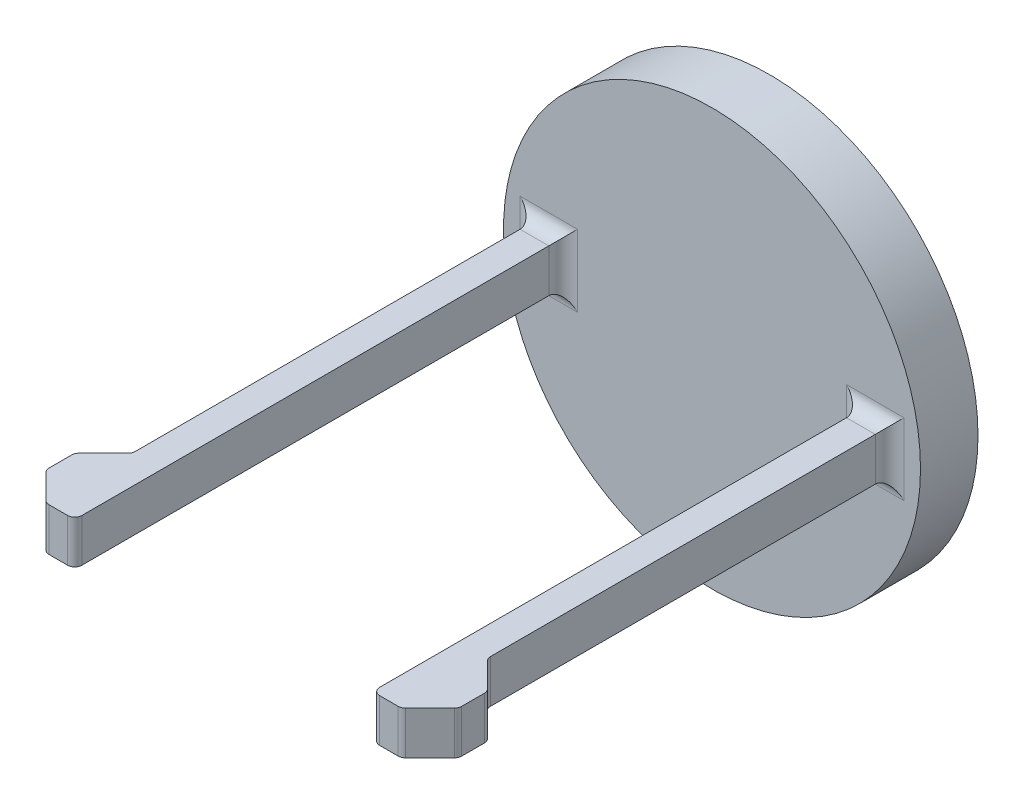
ISO-10303-21;
HEADER;
FILE_DESCRIPTION(('STEP AP214'),'2;1');
FILE_NAME('part.step','',(''),(''),'','','');
FILE_SCHEMA(('AUTOMOTIVE_DESIGN { 1 0 10303 214 1 1 1 1 }'));
ENDSEC;
DATA;
#1=APPLICATION_CONTEXT('core data for automotive mechanical design processes');
#2=APPLICATION_PROTOCOL_DEFINITION('international standard','automotive_design',2000,#1);
#3=PRODUCT_CONTEXT('',#1,'mechanical');
#4=PRODUCT('Part','Part','',(#3));
#5=PRODUCT_RELATED_PRODUCT_CATEGORY('part','',(#4));
#6=PRODUCT_DEFINITION_FORMATION('','',#4);
#7=PRODUCT_DEFINITION_CONTEXT('part definition',#1,'design');
#8=PRODUCT_DEFINITION('design','',#6,#7);
#9=PRODUCT_DEFINITION_SHAPE('','',#8);
#10=(LENGTH_UNIT() NAMED_UNIT(*) SI_UNIT(.MILLI.,.METRE.));
#11=(NAMED_UNIT(*) PLANE_ANGLE_UNIT() SI_UNIT($,.RADIAN.));
#12=(NAMED_UNIT(*) SI_UNIT($,.STERADIAN.) SOLID_ANGLE_UNIT());
#13=UNCERTAINTY_MEASURE_WITH_UNIT(LENGTH_MEASURE(1.E-05),#10,'distance_accuracy_value','');
#14=(GEOMETRIC_REPRESENTATION_CONTEXT(3) GLOBAL_UNCERTAINTY_ASSIGNED_CONTEXT((#13)) GLOBAL_UNIT_ASSIGNED_CONTEXT((#10,
#11,#12)) REPRESENTATION_CONTEXT('',''));
#15=CARTESIAN_POINT('',(0.,0.,0.));
#16=DIRECTION('',(0.,0.,1.));
#17=DIRECTION('',(1.,0.,0.));
#18=AXIS2_PLACEMENT_3D('',#15,#16,#17);
#19=CARTESIAN_POINT('',(12.3535100827569,1.5,37.9738477170273));
#20=DIRECTION('',(0.,-1.,0.));
#21=DIRECTION('',(0.,0.,-1.));
#22=AXIS2_PLACEMENT_3D('',#19,#20,#21);
#23=PLANE('',#22);
#24=DIRECTION('',(0.,0.,-1.));
#25=VECTOR('',#24,1.);
#26=CARTESIAN_POINT('',(10.3535100827569,1.5,37.9738477170273));
#27=LINE('',#26,#25);
#28=CARTESIAN_POINT('',(10.3535100827569,1.5,37.4738477170273));
#29=VERTEX_POINT('',#28);
#30=CARTESIAN_POINT('',(10.3535100827569,1.5,5.));
#31=VERTEX_POINT('',#30);
#32=EDGE_CURVE('E408',#29,#31,#27,.T.);
#33=ORIENTED_EDGE('',*,*,#32,.F.);
#34=CARTESIAN_POINT('',(10.8535100827569,1.5,37.4738477170273));
#35=DIRECTION('',(0.,-1.,0.));
#36=DIRECTION('',(0.,0.,-1.));
#37=AXIS2_PLACEMENT_3D('',#34,#35,#36);
#38=CIRCLE('',#37,0.5);
#39=CARTESIAN_POINT('',(10.8535100827569,1.5,37.9738477170273));
#40=VERTEX_POINT('',#39);
#41=EDGE_CURVE('E379',#29,#40,#38,.F.);
#42=ORIENTED_EDGE('',*,*,#41,.T.);
#43=DIRECTION('',(-1.,0.,0.));
#44=VECTOR('',#43,1.);
#45=CARTESIAN_POINT('',(12.3535100827569,1.5,37.9738477170273));
#46=LINE('',#45,#44);
#47=CARTESIAN_POINT('',(12.1464033015703,1.5,37.9738477170273));
#48=VERTEX_POINT('',#47);
#49=EDGE_CURVE('E456',#48,#40,#46,.T.);
#50=ORIENTED_EDGE('',*,*,#49,.F.);
#51=CARTESIAN_POINT('',(12.1464033015703,1.5,37.4738477170273));
#52=DIRECTION('',(0.,-1.,0.));
#53=DIRECTION('',(0.,0.,-1.));
#54=AXIS2_PLACEMENT_3D('',#51,#52,#53);
#55=CIRCLE('',#54,0.5);
#56=CARTESIAN_POINT('',(12.4999566921636,1.5,37.8274011076206));
#57=VERTEX_POINT('',#56);
#58=EDGE_CURVE('E377',#48,#57,#55,.F.);
#59=ORIENTED_EDGE('',*,*,#58,.T.);
#60=DIRECTION('',(-0.707106781186552,0.,0.707106781186543));
#61=VECTOR('',#60,1.);
#62=CARTESIAN_POINT('',(12.3535100827569,1.5,37.9738477170273));
#63=LINE('',#62,#61);
#64=CARTESIAN_POINT('',(14.2070634733501,1.5,36.1202943264341));
#65=VERTEX_POINT('',#64);
#66=EDGE_CURVE('E307',#65,#57,#63,.T.);
#67=ORIENTED_EDGE('',*,*,#66,.F.);
#68=CARTESIAN_POINT('',(13.8535100827569,1.5,35.7667409358408));
#69=DIRECTION('',(0.,-1.,0.));
#70=DIRECTION('',(0.,0.,-1.));
#71=AXIS2_PLACEMENT_3D('',#68,#69,#70);
#72=CIRCLE('',#71,0.5);
#73=CARTESIAN_POINT('',(14.3535100827569,1.5,35.7667409358408));
#74=VERTEX_POINT('',#73);
#75=EDGE_CURVE('E376',#65,#74,#72,.F.);
#76=ORIENTED_EDGE('',*,*,#75,.T.);
#77=DIRECTION('',(0.,0.,1.));
#78=VECTOR('',#77,1.);
#79=CARTESIAN_POINT('',(14.3535100827569,1.5,37.9738477170273));
#80=LINE('',#79,#78);
#81=CARTESIAN_POINT('',(14.3535100827569,1.5,34.1809544982138));
#82=VERTEX_POINT('',#81);
#83=EDGE_CURVE('E430',#82,#74,#80,.T.);
#84=ORIENTED_EDGE('',*,*,#83,.F.);
#85=CARTESIAN_POINT('',(13.8535100827569,1.5,34.1809544982138));
#86=DIRECTION('',(0.,-1.,0.));
#87=DIRECTION('',(0.,0.,-1.));
#88=AXIS2_PLACEMENT_3D('',#85,#86,#87);
#89=CIRCLE('',#88,0.5);
#90=CARTESIAN_POINT('',(14.2070634733501,1.5,33.8274011076206));
#91=VERTEX_POINT('',#90);
#92=EDGE_CURVE('E53',#82,#91,#89,.F.);
#93=ORIENTED_EDGE('',*,*,#92,.T.);
#94=DIRECTION('',(0.707106781186551,0.,0.707106781186544));
#95=VECTOR('',#94,1.);
#96=CARTESIAN_POINT('',(12.3535100827569,1.5,31.9738477170273));
#97=LINE('',#96,#95);
#98=CARTESIAN_POINT('',(12.4999566921636,1.5,32.120294326434));
#99=VERTEX_POINT('',#98);
#100=EDGE_CURVE('E404',#99,#91,#97,.T.);
#101=ORIENTED_EDGE('',*,*,#100,.F.);
#102=CARTESIAN_POINT('',(12.8535100827569,1.5,31.7667409358408));
#103=DIRECTION('',(0.,-1.,0.));
#104=DIRECTION('',(0.,0.,-1.));
#105=AXIS2_PLACEMENT_3D('',#102,#103,#104);
#106=CIRCLE('',#105,0.5);
#107=CARTESIAN_POINT('',(12.3535100827569,1.5,31.7667409358408));
#108=VERTEX_POINT('',#107);
#109=EDGE_CURVE('E50',#99,#108,#106,.T.);
#110=ORIENTED_EDGE('',*,*,#109,.T.);
#111=DIRECTION('',(0.,0.,-1.));
#112=VECTOR('',#111,1.);
#113=CARTESIAN_POINT('',(12.3535100827569,1.5,37.9738477170273));
#114=LINE('',#113,#112);
#115=CARTESIAN_POINT('',(12.3535100827569,1.5,5.));
#116=VERTEX_POINT('',#115);
#117=EDGE_CURVE('E401',#108,#116,#114,.T.);
#118=ORIENTED_EDGE('',*,*,#117,.T.);
#119=DIRECTION('',(-1.,0.,0.));
#120=VECTOR('',#119,1.);
#121=CARTESIAN_POINT('',(12.3535100827569,1.5,5.));
#122=LINE('',#121,#120);
#123=EDGE_CURVE('E247',#116,#31,#122,.T.);
#124=ORIENTED_EDGE('',*,*,#123,.T.);
#125=EDGE_LOOP('',(#33,#42,#50,#59,#67,#76,#84,#93,#101,#110,#118,#124));
#126=FACE_BOUND('',#125,.T.);
#127=ADVANCED_FACE('F39',(#126),#23,.F.);
#128=CARTESIAN_POINT('',(12.3535100827569,-1.5,37.9738477170273));
#129=DIRECTION('',(0.,1.,0.));
#130=DIRECTION('',(0.,0.,1.));
#131=AXIS2_PLACEMENT_3D('',#128,#129,#130);
#132=PLANE('',#131);
#133=DIRECTION('',(1.,0.,0.));
#134=VECTOR('',#133,1.);
#135=CARTESIAN_POINT('',(12.3535100827569,-1.5,37.9738477170273));
#136=LINE('',#135,#134);
#137=CARTESIAN_POINT('',(10.8535100827569,-1.5,37.9738477170273));
#138=VERTEX_POINT('',#137);
#139=CARTESIAN_POINT('',(12.1464033015703,-1.5,37.9738477170273));
#140=VERTEX_POINT('',#139);
#141=EDGE_CURVE('E468',#138,#140,#136,.T.);
#142=ORIENTED_EDGE('',*,*,#141,.F.);
#143=CARTESIAN_POINT('',(10.8535100827569,-1.5,37.4738477170273));
#144=DIRECTION('',(0.,1.,0.));
#145=DIRECTION('',(0.,0.,1.));
#146=AXIS2_PLACEMENT_3D('',#143,#144,#145);
#147=CIRCLE('',#146,0.5);
#148=CARTESIAN_POINT('',(10.3535100827569,-1.5,37.4738477170273));
#149=VERTEX_POINT('',#148);
#150=EDGE_CURVE('E371',#138,#149,#147,.F.);
#151=ORIENTED_EDGE('',*,*,#150,.T.);
#152=DIRECTION('',(0.,0.,-1.));
#153=VECTOR('',#152,1.);
#154=CARTESIAN_POINT('',(10.3535100827569,-1.5,37.9738477170273));
#155=LINE('',#154,#153);
#156=CARTESIAN_POINT('',(10.3535100827569,-1.5,5.));
#157=VERTEX_POINT('',#156);
#158=EDGE_CURVE('E470',#149,#157,#155,.T.);
#159=ORIENTED_EDGE('',*,*,#158,.T.);
#160=DIRECTION('',(1.,0.,0.));
#161=VECTOR('',#160,1.);
#162=CARTESIAN_POINT('',(12.3535100827569,-1.5,5.));
#163=LINE('',#162,#161);
#164=CARTESIAN_POINT('',(12.3535100827569,-1.5,5.));
#165=VERTEX_POINT('',#164);
#166=EDGE_CURVE('E292',#157,#165,#163,.T.);
#167=ORIENTED_EDGE('',*,*,#166,.T.);
#168=DIRECTION('',(0.,0.,-1.));
#169=VECTOR('',#168,1.);
#170=CARTESIAN_POINT('',(12.3535100827569,-1.5,37.9738477170273));
#171=LINE('',#170,#169);
#172=CARTESIAN_POINT('',(12.3535100827569,-1.5,31.7667409358408));
#173=VERTEX_POINT('',#172);
#174=EDGE_CURVE('E419',#173,#165,#171,.T.);
#175=ORIENTED_EDGE('',*,*,#174,.F.);
#176=CARTESIAN_POINT('',(12.8535100827569,-1.5,31.7667409358408));
#177=DIRECTION('',(0.,1.,0.));
#178=DIRECTION('',(0.,0.,1.));
#179=AXIS2_PLACEMENT_3D('',#176,#177,#178);
#180=CIRCLE('',#179,0.5);
#181=CARTESIAN_POINT('',(12.4999566921636,-1.5,32.120294326434));
#182=VERTEX_POINT('',#181);
#183=EDGE_CURVE('E11',#173,#182,#180,.T.);
#184=ORIENTED_EDGE('',*,*,#183,.T.);
#185=DIRECTION('',(-0.707106781186551,0.,-0.707106781186544));
#186=VECTOR('',#185,1.);
#187=CARTESIAN_POINT('',(12.3535100827569,-1.5,31.9738477170273));
#188=LINE('',#187,#186);
#189=CARTESIAN_POINT('',(14.2070634733501,-1.5,33.8274011076206));
#190=VERTEX_POINT('',#189);
#191=EDGE_CURVE('E418',#190,#182,#188,.T.);
#192=ORIENTED_EDGE('',*,*,#191,.F.);
#193=CARTESIAN_POINT('',(13.8535100827569,-1.5,34.1809544982138));
#194=DIRECTION('',(0.,1.,0.));
#195=DIRECTION('',(0.,0.,1.));
#196=AXIS2_PLACEMENT_3D('',#193,#194,#195);
#197=CIRCLE('',#196,0.5);
#198=CARTESIAN_POINT('',(14.3535100827569,-1.5,34.1809544982138));
#199=VERTEX_POINT('',#198);
#200=EDGE_CURVE('E362',#190,#199,#197,.F.);
#201=ORIENTED_EDGE('',*,*,#200,.T.);
#202=DIRECTION('',(0.,0.,-1.));
#203=VECTOR('',#202,1.);
#204=CARTESIAN_POINT('',(14.3535100827569,-1.5,37.9738477170273));
#205=LINE('',#204,#203);
#206=CARTESIAN_POINT('',(14.3535100827569,-1.5,35.7667409358408));
#207=VERTEX_POINT('',#206);
#208=EDGE_CURVE('E425',#207,#199,#205,.T.);
#209=ORIENTED_EDGE('',*,*,#208,.F.);
#210=CARTESIAN_POINT('',(13.8535100827569,-1.5,35.7667409358408));
#211=DIRECTION('',(0.,1.,0.));
#212=DIRECTION('',(0.,0.,1.));
#213=AXIS2_PLACEMENT_3D('',#210,#211,#212);
#214=CIRCLE('',#213,0.5);
#215=CARTESIAN_POINT('',(14.2070634733501,-1.5,36.1202943264341));
#216=VERTEX_POINT('',#215);
#217=EDGE_CURVE('E370',#207,#216,#214,.F.);
#218=ORIENTED_EDGE('',*,*,#217,.T.);
#219=DIRECTION('',(0.707106781186552,0.,-0.707106781186543));
#220=VECTOR('',#219,1.);
#221=CARTESIAN_POINT('',(12.3535100827569,-1.5,37.9738477170273));
#222=LINE('',#221,#220);
#223=CARTESIAN_POINT('',(12.4999566921636,-1.5,37.8274011076206));
#224=VERTEX_POINT('',#223);
#225=EDGE_CURVE('E429',#224,#216,#222,.T.);
#226=ORIENTED_EDGE('',*,*,#225,.F.);
#227=CARTESIAN_POINT('',(12.1464033015703,-1.5,37.4738477170273));
#228=DIRECTION('',(0.,1.,0.));
#229=DIRECTION('',(0.,0.,1.));
#230=AXIS2_PLACEMENT_3D('',#227,#228,#229);
#231=CIRCLE('',#230,0.5);
#232=EDGE_CURVE('E367',#224,#140,#231,.F.);
#233=ORIENTED_EDGE('',*,*,#232,.T.);
#234=EDGE_LOOP('',(#142,#151,#159,#167,#175,#184,#192,#201,#209,#218,#226,#233));
#235=FACE_BOUND('',#234,.T.);
#236=ADVANCED_FACE('F417',(#235),#132,.F.);
#237=CARTESIAN_POINT('',(0.,0.,37.9738477170273));
#238=DIRECTION('',(0.,0.,-1.));
#239=DIRECTION('',(-1.,0.,0.));
#240=AXIS2_PLACEMENT_3D('',#237,#238,#239);
#241=PLANE('',#240);
#242=ORIENTED_EDGE('',*,*,#49,.T.);
#243=DIRECTION('',(0.,-1.,0.));
#244=VECTOR('',#243,1.);
#245=CARTESIAN_POINT('',(10.8535100827569,0.,37.9738477170273));
#246=LINE('',#245,#244);
#247=EDGE_CURVE('E365',#40,#138,#246,.T.);
#248=ORIENTED_EDGE('',*,*,#247,.T.);
#249=ORIENTED_EDGE('',*,*,#141,.T.);
#250=DIRECTION('',(0.,-1.,0.));
#251=VECTOR('',#250,1.);
#252=CARTESIAN_POINT('',(12.1464033015703,0.,37.9738477170273));
#253=LINE('',#252,#251);
#254=EDGE_CURVE('E359',#140,#48,#253,.F.);
#255=ORIENTED_EDGE('',*,*,#254,.T.);
#256=EDGE_LOOP('',(#242,#248,#249,#255));
#257=FACE_BOUND('',#256,.T.);
#258=ADVANCED_FACE('F480',(#257),#241,.F.);
#259=CARTESIAN_POINT('',(14.3535100827569,0.,0.));
#260=DIRECTION('',(1.,0.,0.));
#261=DIRECTION('',(0.,0.,-1.));
#262=AXIS2_PLACEMENT_3D('',#259,#260,#261);
#263=PLANE('',#262);
#264=ORIENTED_EDGE('',*,*,#83,.T.);
#265=DIRECTION('',(0.,-1.,0.));
#266=VECTOR('',#265,1.);
#267=CARTESIAN_POINT('',(14.3535100827569,-1.5,35.7667409358408));
#268=LINE('',#267,#266);
#269=EDGE_CURVE('E386',#74,#207,#268,.T.);
#270=ORIENTED_EDGE('',*,*,#269,.T.);
#271=ORIENTED_EDGE('',*,*,#208,.T.);
#272=DIRECTION('',(0.,-1.,0.));
#273=VECTOR('',#272,1.);
#274=CARTESIAN_POINT('',(14.3535100827569,1.5,34.1809544982138));
#275=LINE('',#274,#273);
#276=EDGE_CURVE('E390',#199,#82,#275,.F.);
#277=ORIENTED_EDGE('',*,*,#276,.T.);
#278=EDGE_LOOP('',(#264,#270,#271,#277));
#279=FACE_BOUND('',#278,.T.);
#280=ADVANCED_FACE('F536',(#279),#263,.T.);
#281=CARTESIAN_POINT('',(12.3535100827569,1.5,37.9738477170273));
#282=DIRECTION('',(-1.,0.,0.));
#283=DIRECTION('',(0.,0.,1.));
#284=AXIS2_PLACEMENT_3D('',#281,#282,#283);
#285=PLANE('',#284);
#286=ORIENTED_EDGE('',*,*,#117,.F.);
#287=DIRECTION('',(0.,1.,0.));
#288=VECTOR('',#287,1.);
#289=CARTESIAN_POINT('',(12.3535100827569,-1.5,31.7667409358408));
#290=LINE('',#289,#288);
#291=EDGE_CURVE('E400',#108,#173,#290,.F.);
#292=ORIENTED_EDGE('',*,*,#291,.T.);
#293=ORIENTED_EDGE('',*,*,#174,.T.);
#294=DIRECTION('',(0.,1.,0.));
#295=VECTOR('',#294,1.);
#296=CARTESIAN_POINT('',(12.3535100827569,1.5,5.));
#297=LINE('',#296,#295);
#298=EDGE_CURVE('E250',#165,#116,#297,.T.);
#299=ORIENTED_EDGE('',*,*,#298,.T.);
#300=EDGE_LOOP('',(#286,#292,#293,#299));
#301=FACE_BOUND('',#300,.T.);
#302=ADVANCED_FACE('F407',(#301),#285,.F.);
#303=CARTESIAN_POINT('',(-12.3535100827569,1.5,37.9738477170273));
#304=DIRECTION('',(0.,-1.,0.));
#305=DIRECTION('',(0.,0.,-1.));
#306=AXIS2_PLACEMENT_3D('',#303,#304,#305);
#307=PLANE('',#306);
#308=DIRECTION('',(0.707106781186551,0.,-0.707106781186544));
#309=VECTOR('',#308,1.);
#310=CARTESIAN_POINT('',(-12.3535100827569,1.5,31.9738477170273));
#311=LINE('',#310,#309);
#312=CARTESIAN_POINT('',(-14.2070634733501,1.5,33.8274011076206));
#313=VERTEX_POINT('',#312);
#314=CARTESIAN_POINT('',(-12.4999566921636,1.5,32.120294326434));
#315=VERTEX_POINT('',#314);
#316=EDGE_CURVE('E445',#313,#315,#311,.T.);
#317=ORIENTED_EDGE('',*,*,#316,.F.);
#318=CARTESIAN_POINT('',(-13.8535100827569,1.5,34.1809544982138));
#319=DIRECTION('',(0.,-1.,0.));
#320=DIRECTION('',(0.,0.,-1.));
#321=AXIS2_PLACEMENT_3D('',#318,#319,#320);
#322=CIRCLE('',#321,0.5);
#323=CARTESIAN_POINT('',(-14.3535100827569,1.5,34.1809544982138));
#324=VERTEX_POINT('',#323);
#325=EDGE_CURVE('E343',#313,#324,#322,.F.);
#326=ORIENTED_EDGE('',*,*,#325,.T.);
#327=DIRECTION('',(0.,0.,-1.));
#328=VECTOR('',#327,1.);
#329=CARTESIAN_POINT('',(-14.3535100827569,1.5,37.9738477170273));
#330=LINE('',#329,#328);
#331=CARTESIAN_POINT('',(-14.3535100827569,1.5,35.7667409358408));
#332=VERTEX_POINT('',#331);
#333=EDGE_CURVE('E447',#332,#324,#330,.T.);
#334=ORIENTED_EDGE('',*,*,#333,.F.);
#335=CARTESIAN_POINT('',(-13.8535100827569,1.5,35.7667409358408));
#336=DIRECTION('',(0.,-1.,0.));
#337=DIRECTION('',(0.,0.,-1.));
#338=AXIS2_PLACEMENT_3D('',#335,#336,#337);
#339=CIRCLE('',#338,0.5);
#340=CARTESIAN_POINT('',(-14.2070634733501,1.5,36.120294326434));
#341=VERTEX_POINT('',#340);
#342=EDGE_CURVE('E344',#332,#341,#339,.F.);
#343=ORIENTED_EDGE('',*,*,#342,.T.);
#344=DIRECTION('',(-0.707106781186551,0.,-0.707106781186544));
#345=VECTOR('',#344,1.);
#346=CARTESIAN_POINT('',(-12.3535100827569,1.5,37.9738477170273));
#347=LINE('',#346,#345);
#348=CARTESIAN_POINT('',(-12.4999566921636,1.5,37.8274011076206));
#349=VERTEX_POINT('',#348);
#350=EDGE_CURVE('E442',#349,#341,#347,.T.);
#351=ORIENTED_EDGE('',*,*,#350,.F.);
#352=CARTESIAN_POINT('',(-12.1464033015703,1.5,37.4738477170273));
#353=DIRECTION('',(0.,-1.,0.));
#354=DIRECTION('',(0.,0.,-1.));
#355=AXIS2_PLACEMENT_3D('',#352,#353,#354);
#356=CIRCLE('',#355,0.5);
#357=CARTESIAN_POINT('',(-12.1464033015703,1.5,37.9738477170273));
#358=VERTEX_POINT('',#357);
#359=EDGE_CURVE('E342',#349,#358,#356,.F.);
#360=ORIENTED_EDGE('',*,*,#359,.T.);
#361=DIRECTION('',(-1.,0.,0.));
#362=VECTOR('',#361,1.);
#363=CARTESIAN_POINT('',(-12.3535100827569,1.5,37.9738477170273));
#364=LINE('',#363,#362);
#365=CARTESIAN_POINT('',(-10.8535100827569,1.5,37.9738477170273));
#366=VERTEX_POINT('',#365);
#367=EDGE_CURVE('E453',#366,#358,#364,.T.);
#368=ORIENTED_EDGE('',*,*,#367,.F.);
#369=CARTESIAN_POINT('',(-10.8535100827569,1.5,37.4738477170273));
#370=DIRECTION('',(0.,-1.,0.));
#371=DIRECTION('',(0.,0.,-1.));
#372=AXIS2_PLACEMENT_3D('',#369,#370,#371);
#373=CIRCLE('',#372,0.5);
#374=CARTESIAN_POINT('',(-10.3535100827569,1.5,37.4738477170273));
#375=VERTEX_POINT('',#374);
#376=EDGE_CURVE('E339',#366,#375,#373,.F.);
#377=ORIENTED_EDGE('',*,*,#376,.T.);
#378=DIRECTION('',(0.,0.,-1.));
#379=VECTOR('',#378,1.);
#380=CARTESIAN_POINT('',(-10.3535100827569,1.5,37.9738477170273));
#381=LINE('',#380,#379);
#382=CARTESIAN_POINT('',(-10.3535100827569,1.5,5.));
#383=VERTEX_POINT('',#382);
#384=EDGE_CURVE('E463',#375,#383,#381,.T.);
#385=ORIENTED_EDGE('',*,*,#384,.T.);
#386=DIRECTION('',(-1.,0.,0.));
#387=VECTOR('',#386,1.);
#388=CARTESIAN_POINT('',(-12.3535100827569,1.5,5.));
#389=LINE('',#388,#387);
#390=CARTESIAN_POINT('',(-12.3535100827569,1.5,5.));
#391=VERTEX_POINT('',#390);
#392=EDGE_CURVE('E289',#383,#391,#389,.T.);
#393=ORIENTED_EDGE('',*,*,#392,.T.);
#394=DIRECTION('',(0.,0.,-1.));
#395=VECTOR('',#394,1.);
#396=CARTESIAN_POINT('',(-12.3535100827569,1.5,37.9738477170273));
#397=LINE('',#396,#395);
#398=CARTESIAN_POINT('',(-12.3535100827569,1.5,31.7667409358408));
#399=VERTEX_POINT('',#398);
#400=EDGE_CURVE('E236',#399,#391,#397,.T.);
#401=ORIENTED_EDGE('',*,*,#400,.F.);
#402=CARTESIAN_POINT('',(-12.8535100827569,1.5,31.7667409358408));
#403=DIRECTION('',(0.,-1.,0.));
#404=DIRECTION('',(0.,0.,-1.));
#405=AXIS2_PLACEMENT_3D('',#402,#403,#404);
#406=CIRCLE('',#405,0.5);
#407=EDGE_CURVE('E399',#399,#315,#406,.T.);
#408=ORIENTED_EDGE('',*,*,#407,.T.);
#409=EDGE_LOOP('',(#317,#326,#334,#343,#351,#360,#368,#377,#385,#393,#401,#408));
#410=FACE_BOUND('',#409,.T.);
#411=ADVANCED_FACE('F547',(#410),#307,.F.);
#412=CARTESIAN_POINT('',(-12.3535100827569,-1.5,37.9738477170273));
#413=DIRECTION('',(0.,1.,0.));
#414=DIRECTION('',(0.,0.,1.));
#415=AXIS2_PLACEMENT_3D('',#412,#413,#414);
#416=PLANE('',#415);
#417=DIRECTION('',(0.,0.,1.));
#418=VECTOR('',#417,1.);
#419=CARTESIAN_POINT('',(-14.3535100827569,-1.5,37.9738477170273));
#420=LINE('',#419,#418);
#421=CARTESIAN_POINT('',(-14.3535100827569,-1.5,34.1809544982138));
#422=VERTEX_POINT('',#421);
#423=CARTESIAN_POINT('',(-14.3535100827569,-1.5,35.7667409358408));
#424=VERTEX_POINT('',#423);
#425=EDGE_CURVE('E412',#422,#424,#420,.T.);
#426=ORIENTED_EDGE('',*,*,#425,.F.);
#427=CARTESIAN_POINT('',(-13.8535100827569,-1.5,34.1809544982138));
#428=DIRECTION('',(0.,1.,0.));
#429=DIRECTION('',(0.,0.,1.));
#430=AXIS2_PLACEMENT_3D('',#427,#428,#429);
#431=CIRCLE('',#430,0.5);
#432=CARTESIAN_POINT('',(-14.2070634733501,-1.5,33.8274011076206));
#433=VERTEX_POINT('',#432);
#434=EDGE_CURVE('E340',#422,#433,#431,.F.);
#435=ORIENTED_EDGE('',*,*,#434,.T.);
#436=DIRECTION('',(-0.707106781186551,0.,0.707106781186544));
#437=VECTOR('',#436,1.);
#438=CARTESIAN_POINT('',(-12.3535100827569,-1.5,31.9738477170273));
#439=LINE('',#438,#437);
#440=CARTESIAN_POINT('',(-12.4999566921636,-1.5,32.120294326434));
#441=VERTEX_POINT('',#440);
#442=EDGE_CURVE('E437',#441,#433,#439,.T.);
#443=ORIENTED_EDGE('',*,*,#442,.F.);
#444=CARTESIAN_POINT('',(-12.8535100827569,-1.5,31.7667409358408));
#445=DIRECTION('',(0.,1.,0.));
#446=DIRECTION('',(0.,0.,1.));
#447=AXIS2_PLACEMENT_3D('',#444,#445,#446);
#448=CIRCLE('',#447,0.5);
#449=CARTESIAN_POINT('',(-12.3535100827569,-1.5,31.7667409358408));
#450=VERTEX_POINT('',#449);
#451=EDGE_CURVE('E231',#441,#450,#448,.T.);
#452=ORIENTED_EDGE('',*,*,#451,.T.);
#453=DIRECTION('',(0.,0.,-1.));
#454=VECTOR('',#453,1.);
#455=CARTESIAN_POINT('',(-12.3535100827569,-1.5,37.9738477170273));
#456=LINE('',#455,#454);
#457=CARTESIAN_POINT('',(-12.3535100827569,-1.5,5.));
#458=VERTEX_POINT('',#457);
#459=EDGE_CURVE('E224',#450,#458,#456,.T.);
#460=ORIENTED_EDGE('',*,*,#459,.T.);
#461=DIRECTION('',(1.,0.,0.));
#462=VECTOR('',#461,1.);
#463=CARTESIAN_POINT('',(-12.3535100827569,-1.5,5.));
#464=LINE('',#463,#462);
#465=CARTESIAN_POINT('',(-10.3535100827569,-1.5,5.));
#466=VERTEX_POINT('',#465);
#467=EDGE_CURVE('E233',#458,#466,#464,.T.);
#468=ORIENTED_EDGE('',*,*,#467,.T.);
#469=DIRECTION('',(0.,0.,-1.));
#470=VECTOR('',#469,1.);
#471=CARTESIAN_POINT('',(-10.3535100827569,-1.5,37.9738477170273));
#472=LINE('',#471,#470);
#473=CARTESIAN_POINT('',(-10.3535100827569,-1.5,37.4738477170273));
#474=VERTEX_POINT('',#473);
#475=EDGE_CURVE('E240',#474,#466,#472,.T.);
#476=ORIENTED_EDGE('',*,*,#475,.F.);
#477=CARTESIAN_POINT('',(-10.8535100827569,-1.5,37.4738477170273));
#478=DIRECTION('',(0.,1.,0.));
#479=DIRECTION('',(0.,0.,1.));
#480=AXIS2_PLACEMENT_3D('',#477,#478,#479);
#481=CIRCLE('',#480,0.5);
#482=CARTESIAN_POINT('',(-10.8535100827569,-1.5,37.9738477170273));
#483=VERTEX_POINT('',#482);
#484=EDGE_CURVE('E331',#474,#483,#481,.F.);
#485=ORIENTED_EDGE('',*,*,#484,.T.);
#486=DIRECTION('',(1.,0.,0.));
#487=VECTOR('',#486,1.);
#488=CARTESIAN_POINT('',(-12.3535100827569,-1.5,37.9738477170273));
#489=LINE('',#488,#487);
#490=CARTESIAN_POINT('',(-12.1464033015703,-1.5,37.9738477170273));
#491=VERTEX_POINT('',#490);
#492=EDGE_CURVE('E459',#491,#483,#489,.T.);
#493=ORIENTED_EDGE('',*,*,#492,.F.);
#494=CARTESIAN_POINT('',(-12.1464033015703,-1.5,37.4738477170273));
#495=DIRECTION('',(0.,1.,0.));
#496=DIRECTION('',(0.,0.,1.));
#497=AXIS2_PLACEMENT_3D('',#494,#495,#496);
#498=CIRCLE('',#497,0.5);
#499=CARTESIAN_POINT('',(-12.4999566921636,-1.5,37.8274011076206));
#500=VERTEX_POINT('',#499);
#501=EDGE_CURVE('E332',#491,#500,#498,.F.);
#502=ORIENTED_EDGE('',*,*,#501,.T.);
#503=DIRECTION('',(0.707106781186551,0.,0.707106781186544));
#504=VECTOR('',#503,1.);
#505=CARTESIAN_POINT('',(-12.3535100827569,-1.5,37.9738477170273));
#506=LINE('',#505,#504);
#507=CARTESIAN_POINT('',(-14.2070634733501,-1.5,36.120294326434));
#508=VERTEX_POINT('',#507);
#509=EDGE_CURVE('E438',#508,#500,#506,.T.);
#510=ORIENTED_EDGE('',*,*,#509,.F.);
#511=CARTESIAN_POINT('',(-13.8535100827569,-1.5,35.7667409358408));
#512=DIRECTION('',(0.,1.,0.));
#513=DIRECTION('',(0.,0.,1.));
#514=AXIS2_PLACEMENT_3D('',#511,#512,#513);
#515=CIRCLE('',#514,0.5);
#516=EDGE_CURVE('E334',#508,#424,#515,.F.);
#517=ORIENTED_EDGE('',*,*,#516,.T.);
#518=EDGE_LOOP('',(#426,#435,#443,#452,#460,#468,#476,#485,#493,#502,#510,#517));
#519=FACE_BOUND('',#518,.T.);
#520=ADVANCED_FACE('F226',(#519),#416,.F.);
#521=CARTESIAN_POINT('',(0.,0.,37.9738477170273));
#522=DIRECTION('',(0.,0.,1.));
#523=DIRECTION('',(1.,0.,0.));
#524=AXIS2_PLACEMENT_3D('',#521,#522,#523);
#525=PLANE('',#524);
#526=ORIENTED_EDGE('',*,*,#367,.T.);
#527=DIRECTION('',(0.,-1.,0.));
#528=VECTOR('',#527,1.);
#529=CARTESIAN_POINT('',(-12.1464033015703,-1.5,37.9738477170273));
#530=LINE('',#529,#528);
#531=EDGE_CURVE('E354',#358,#491,#530,.T.);
#532=ORIENTED_EDGE('',*,*,#531,.T.);
#533=ORIENTED_EDGE('',*,*,#492,.T.);
#534=DIRECTION('',(0.,1.,0.));
#535=VECTOR('',#534,1.);
#536=CARTESIAN_POINT('',(-10.8535100827569,1.5,37.9738477170273));
#537=LINE('',#536,#535);
#538=EDGE_CURVE('E355',#483,#366,#537,.T.);
#539=ORIENTED_EDGE('',*,*,#538,.T.);
#540=EDGE_LOOP('',(#526,#532,#533,#539));
#541=FACE_BOUND('',#540,.T.);
#542=ADVANCED_FACE('F562',(#541),#525,.T.);
#543=CARTESIAN_POINT('',(-14.3535100827569,0.,0.));
#544=DIRECTION('',(-1.,0.,0.));
#545=DIRECTION('',(0.,0.,1.));
#546=AXIS2_PLACEMENT_3D('',#543,#544,#545);
#547=PLANE('',#546);
#548=ORIENTED_EDGE('',*,*,#333,.T.);
#549=DIRECTION('',(0.,-1.,0.));
#550=VECTOR('',#549,1.);
#551=CARTESIAN_POINT('',(-14.3535100827569,-1.5,34.1809544982138));
#552=LINE('',#551,#550);
#553=EDGE_CURVE('E329',#324,#422,#552,.T.);
#554=ORIENTED_EDGE('',*,*,#553,.T.);
#555=ORIENTED_EDGE('',*,*,#425,.T.);
#556=DIRECTION('',(0.,-1.,0.));
#557=VECTOR('',#556,1.);
#558=CARTESIAN_POINT('',(-14.3535100827569,1.5,35.7667409358408));
#559=LINE('',#558,#557);
#560=EDGE_CURVE('E327',#424,#332,#559,.F.);
#561=ORIENTED_EDGE('',*,*,#560,.T.);
#562=EDGE_LOOP('',(#548,#554,#555,#561));
#563=FACE_BOUND('',#562,.T.);
#564=ADVANCED_FACE('F561',(#563),#547,.T.);
#565=CARTESIAN_POINT('',(-12.3535100827569,1.5,37.9738477170273));
#566=DIRECTION('',(1.,0.,0.));
#567=DIRECTION('',(0.,0.,-1.));
#568=AXIS2_PLACEMENT_3D('',#565,#566,#567);
#569=PLANE('',#568);
#570=ORIENTED_EDGE('',*,*,#459,.F.);
#571=DIRECTION('',(0.,-1.,0.));
#572=VECTOR('',#571,1.);
#573=CARTESIAN_POINT('',(-12.3535100827569,1.5,31.7667409358408));
#574=LINE('',#573,#572);
#575=EDGE_CURVE('E321',#450,#399,#574,.F.);
#576=ORIENTED_EDGE('',*,*,#575,.T.);
#577=ORIENTED_EDGE('',*,*,#400,.T.);
#578=DIRECTION('',(0.,-1.,0.));
#579=VECTOR('',#578,1.);
#580=CARTESIAN_POINT('',(-12.3535100827569,1.5,5.));
#581=LINE('',#580,#579);
#582=EDGE_CURVE('E239',#391,#458,#581,.T.);
#583=ORIENTED_EDGE('',*,*,#582,.T.);
#584=EDGE_LOOP('',(#570,#576,#577,#583));
#585=FACE_BOUND('',#584,.T.);
#586=ADVANCED_FACE('F245',(#585),#569,.F.);
#587=CARTESIAN_POINT('',(0.,0.,4.));
#588=DIRECTION('',(0.,0.,-1.));
#589=DIRECTION('',(-1.,0.,0.));
#590=AXIS2_PLACEMENT_3D('',#587,#588,#589);
#591=CYLINDRICAL_SURFACE('',#590,14.5);
#592=CARTESIAN_POINT('',(0.,0.,4.));
#593=DIRECTION('',(0.,0.,1.));
#594=DIRECTION('',(1.,0.,0.));
#595=AXIS2_PLACEMENT_3D('',#592,#593,#594);
#596=CIRCLE('',#595,14.5);
#597=CARTESIAN_POINT('',(14.5,0.,4.));
#598=VERTEX_POINT('',#597);
#599=EDGE_CURVE('E263',#598,#598,#596,.T.);
#600=ORIENTED_EDGE('',*,*,#599,.F.);
#601=EDGE_LOOP('',(#600));
#602=FACE_BOUND('',#601,.T.);
#603=CARTESIAN_POINT('',(0.,0.,0.));
#604=DIRECTION('',(0.,0.,1.));
#605=DIRECTION('',(1.,0.,0.));
#606=AXIS2_PLACEMENT_3D('',#603,#604,#605);
#607=CIRCLE('',#606,14.5);
#608=CARTESIAN_POINT('',(14.5,0.,0.));
#609=VERTEX_POINT('',#608);
#610=EDGE_CURVE('E269',#609,#609,#607,.T.);
#611=ORIENTED_EDGE('',*,*,#610,.T.);
#612=EDGE_LOOP('',(#611));
#613=FACE_BOUND('',#612,.T.);
#614=ADVANCED_FACE('F509',(#602,#613),#591,.T.);
#615=CARTESIAN_POINT('',(0.,0.,4.));
#616=DIRECTION('',(0.,0.,1.));
#617=DIRECTION('',(1.,0.,0.));
#618=AXIS2_PLACEMENT_3D('',#615,#616,#617);
#619=PLANE('',#618);
#620=DIRECTION('',(0.,1.,0.));
#621=VECTOR('',#620,1.);
#622=CARTESIAN_POINT('',(-9.35351008275688,0.,4.));
#623=LINE('',#622,#621);
#624=CARTESIAN_POINT('',(-9.35351008275688,2.5,4.));
#625=VERTEX_POINT('',#624);
#626=CARTESIAN_POINT('',(-9.35351008275688,-2.5,4.));
#627=VERTEX_POINT('',#626);
#628=EDGE_CURVE('E284',#625,#627,#623,.F.);
#629=ORIENTED_EDGE('',*,*,#628,.T.);
#630=DIRECTION('',(1.,0.,0.));
#631=VECTOR('',#630,1.);
#632=CARTESIAN_POINT('',(0.,-2.5,4.));
#633=LINE('',#632,#631);
#634=CARTESIAN_POINT('',(-13.3535100827569,-2.5,4.));
#635=VERTEX_POINT('',#634);
#636=EDGE_CURVE('E283',#627,#635,#633,.F.);
#637=ORIENTED_EDGE('',*,*,#636,.T.);
#638=DIRECTION('',(0.,-1.,0.));
#639=VECTOR('',#638,1.);
#640=CARTESIAN_POINT('',(-13.3535100827569,0.,4.));
#641=LINE('',#640,#639);
#642=CARTESIAN_POINT('',(-13.3535100827569,2.5,4.));
#643=VERTEX_POINT('',#642);
#644=EDGE_CURVE('E254',#635,#643,#641,.F.);
#645=ORIENTED_EDGE('',*,*,#644,.T.);
#646=DIRECTION('',(-1.,0.,0.));
#647=VECTOR('',#646,1.);
#648=CARTESIAN_POINT('',(0.,2.5,4.));
#649=LINE('',#648,#647);
#650=EDGE_CURVE('E282',#643,#625,#649,.F.);
#651=ORIENTED_EDGE('',*,*,#650,.T.);
#652=EDGE_LOOP('',(#629,#637,#645,#651));
#653=FACE_BOUND('',#652,.T.);
#654=DIRECTION('',(0.,1.,0.));
#655=VECTOR('',#654,1.);
#656=CARTESIAN_POINT('',(13.3535100827569,0.,4.));
#657=LINE('',#656,#655);
#658=CARTESIAN_POINT('',(13.3535100827569,2.5,4.));
#659=VERTEX_POINT('',#658);
#660=CARTESIAN_POINT('',(13.3535100827569,-2.5,4.));
#661=VERTEX_POINT('',#660);
#662=EDGE_CURVE('E261',#659,#661,#657,.F.);
#663=ORIENTED_EDGE('',*,*,#662,.T.);
#664=DIRECTION('',(1.,0.,0.));
#665=VECTOR('',#664,1.);
#666=CARTESIAN_POINT('',(0.,-2.5,4.));
#667=LINE('',#666,#665);
#668=CARTESIAN_POINT('',(9.35351008275688,-2.5,4.));
#669=VERTEX_POINT('',#668);
#670=EDGE_CURVE('E280',#661,#669,#667,.F.);
#671=ORIENTED_EDGE('',*,*,#670,.T.);
#672=DIRECTION('',(0.,-1.,0.));
#673=VECTOR('',#672,1.);
#674=CARTESIAN_POINT('',(9.35351008275688,0.,4.));
#675=LINE('',#674,#673);
#676=CARTESIAN_POINT('',(9.35351008275688,2.5,4.));
#677=VERTEX_POINT('',#676);
#678=EDGE_CURVE('E273',#669,#677,#675,.F.);
#679=ORIENTED_EDGE('',*,*,#678,.T.);
#680=DIRECTION('',(-1.,0.,0.));
#681=VECTOR('',#680,1.);
#682=CARTESIAN_POINT('',(0.,2.5,4.));
#683=LINE('',#682,#681);
#684=EDGE_CURVE('E270',#677,#659,#683,.F.);
#685=ORIENTED_EDGE('',*,*,#684,.T.);
#686=EDGE_LOOP('',(#663,#671,#679,#685));
#687=FACE_BOUND('',#686,.T.);
#688=ORIENTED_EDGE('',*,*,#599,.T.);
#689=EDGE_LOOP('',(#688));
#690=FACE_BOUND('',#689,.T.);
#691=ADVANCED_FACE('F506',(#653,#687,#690),#619,.T.);
#692=CARTESIAN_POINT('',(0.,0.,0.));
#693=DIRECTION('',(0.,0.,1.));
#694=DIRECTION('',(1.,0.,0.));
#695=AXIS2_PLACEMENT_3D('',#692,#693,#694);
#696=PLANE('',#695);
#697=ORIENTED_EDGE('',*,*,#610,.F.);
#698=EDGE_LOOP('',(#697));
#699=FACE_BOUND('',#698,.T.);
#700=ADVANCED_FACE('F508',(#699),#696,.F.);
#701=CARTESIAN_POINT('',(10.3535100827569,1.5,37.9738477170273));
#702=DIRECTION('',(1.,0.,0.));
#703=DIRECTION('',(0.,0.,-1.));
#704=AXIS2_PLACEMENT_3D('',#701,#702,#703);
#705=PLANE('',#704);
#706=ORIENTED_EDGE('',*,*,#158,.F.);
#707=DIRECTION('',(0.,-1.,0.));
#708=VECTOR('',#707,1.);
#709=CARTESIAN_POINT('',(10.3535100827569,1.5,37.4738477170273));
#710=LINE('',#709,#708);
#711=EDGE_CURVE('E373',#149,#29,#710,.F.);
#712=ORIENTED_EDGE('',*,*,#711,.T.);
#713=ORIENTED_EDGE('',*,*,#32,.T.);
#714=DIRECTION('',(0.,-1.,0.));
#715=VECTOR('',#714,1.);
#716=CARTESIAN_POINT('',(10.3535100827569,1.5,5.));
#717=LINE('',#716,#715);
#718=EDGE_CURVE('E294',#31,#157,#717,.T.);
#719=ORIENTED_EDGE('',*,*,#718,.T.);
#720=EDGE_LOOP('',(#706,#712,#713,#719));
#721=FACE_BOUND('',#720,.T.);
#722=ADVANCED_FACE('F488',(#721),#705,.F.);
#723=CARTESIAN_POINT('',(-10.3535100827569,1.5,37.9738477170273));
#724=DIRECTION('',(-1.,0.,0.));
#725=DIRECTION('',(0.,0.,1.));
#726=AXIS2_PLACEMENT_3D('',#723,#724,#725);
#727=PLANE('',#726);
#728=ORIENTED_EDGE('',*,*,#384,.F.);
#729=DIRECTION('',(0.,1.,0.));
#730=VECTOR('',#729,1.);
#731=CARTESIAN_POINT('',(-10.3535100827569,-1.5,37.4738477170273));
#732=LINE('',#731,#730);
#733=EDGE_CURVE('E356',#375,#474,#732,.F.);
#734=ORIENTED_EDGE('',*,*,#733,.T.);
#735=ORIENTED_EDGE('',*,*,#475,.T.);
#736=DIRECTION('',(0.,1.,0.));
#737=VECTOR('',#736,1.);
#738=CARTESIAN_POINT('',(-10.3535100827569,1.5,5.));
#739=LINE('',#738,#737);
#740=EDGE_CURVE('E290',#466,#383,#739,.T.);
#741=ORIENTED_EDGE('',*,*,#740,.T.);
#742=EDGE_LOOP('',(#728,#734,#735,#741));
#743=FACE_BOUND('',#742,.T.);
#744=ADVANCED_FACE('F526',(#743),#727,.F.);
#745=CARTESIAN_POINT('',(-12.3535100827569,14.501,37.9738477170273));
#746=DIRECTION('',(0.707106781186544,0.,-0.707106781186551));
#747=DIRECTION('',(-0.707106781186551,0.,-0.707106781186544));
#748=AXIS2_PLACEMENT_3D('',#745,#746,#747);
#749=PLANE('',#748);
#750=ORIENTED_EDGE('',*,*,#350,.T.);
#751=DIRECTION('',(0.,-1.,0.));
#752=VECTOR('',#751,1.);
#753=CARTESIAN_POINT('',(-14.2070634733501,-1.5,36.120294326434));
#754=LINE('',#753,#752);
#755=EDGE_CURVE('E346',#341,#508,#754,.T.);
#756=ORIENTED_EDGE('',*,*,#755,.T.);
#757=ORIENTED_EDGE('',*,*,#509,.T.);
#758=DIRECTION('',(0.,-1.,0.));
#759=VECTOR('',#758,1.);
#760=CARTESIAN_POINT('',(-12.4999566921636,1.5,37.8274011076206));
#761=LINE('',#760,#759);
#762=EDGE_CURVE('E350',#500,#349,#761,.F.);
#763=ORIENTED_EDGE('',*,*,#762,.T.);
#764=EDGE_LOOP('',(#750,#756,#757,#763));
#765=FACE_BOUND('',#764,.T.);
#766=ADVANCED_FACE('F558',(#765),#749,.F.);
#767=CARTESIAN_POINT('',(-12.3535100827569,14.501,31.9738477170273));
#768=DIRECTION('',(0.707106781186544,0.,0.707106781186551));
#769=DIRECTION('',(0.707106781186551,0.,-0.707106781186544));
#770=AXIS2_PLACEMENT_3D('',#767,#768,#769);
#771=PLANE('',#770);
#772=ORIENTED_EDGE('',*,*,#316,.T.);
#773=DIRECTION('',(0.,-1.,0.));
#774=VECTOR('',#773,1.);
#775=CARTESIAN_POINT('',(-12.4999566921636,-1.5,32.120294326434));
#776=LINE('',#775,#774);
#777=EDGE_CURVE('E322',#315,#441,#776,.T.);
#778=ORIENTED_EDGE('',*,*,#777,.T.);
#779=ORIENTED_EDGE('',*,*,#442,.T.);
#780=DIRECTION('',(0.,-1.,0.));
#781=VECTOR('',#780,1.);
#782=CARTESIAN_POINT('',(-14.2070634733501,1.5,33.8274011076206));
#783=LINE('',#782,#781);
#784=EDGE_CURVE('E305',#433,#313,#783,.F.);
#785=ORIENTED_EDGE('',*,*,#784,.T.);
#786=EDGE_LOOP('',(#772,#778,#779,#785));
#787=FACE_BOUND('',#786,.T.);
#788=ADVANCED_FACE('F551',(#787),#771,.F.);
#789=CARTESIAN_POINT('',(12.3535100827569,14.501,37.9738477170273));
#790=DIRECTION('',(-0.707106781186543,0.,-0.707106781186552));
#791=DIRECTION('',(-0.707106781186552,0.,0.707106781186543));
#792=AXIS2_PLACEMENT_3D('',#789,#790,#791);
#793=PLANE('',#792);
#794=ORIENTED_EDGE('',*,*,#66,.T.);
#795=DIRECTION('',(0.,-1.,0.));
#796=VECTOR('',#795,1.);
#797=CARTESIAN_POINT('',(12.4999566921636,14.501,37.8274011076206));
#798=LINE('',#797,#796);
#799=EDGE_CURVE('E381',#57,#224,#798,.T.);
#800=ORIENTED_EDGE('',*,*,#799,.T.);
#801=ORIENTED_EDGE('',*,*,#225,.T.);
#802=DIRECTION('',(0.,-1.,0.));
#803=VECTOR('',#802,1.);
#804=CARTESIAN_POINT('',(14.2070634733501,1.5,36.1202943264341));
#805=LINE('',#804,#803);
#806=EDGE_CURVE('E385',#216,#65,#805,.F.);
#807=ORIENTED_EDGE('',*,*,#806,.T.);
#808=EDGE_LOOP('',(#794,#800,#801,#807));
#809=FACE_BOUND('',#808,.T.);
#810=ADVANCED_FACE('F553',(#809),#793,.F.);
#811=CARTESIAN_POINT('',(12.3535100827569,14.501,31.9738477170273));
#812=DIRECTION('',(-0.707106781186544,0.,0.707106781186551));
#813=DIRECTION('',(0.707106781186551,0.,0.707106781186544));
#814=AXIS2_PLACEMENT_3D('',#811,#812,#813);
#815=PLANE('',#814);
#816=ORIENTED_EDGE('',*,*,#100,.T.);
#817=DIRECTION('',(0.,-1.,0.));
#818=VECTOR('',#817,1.);
#819=CARTESIAN_POINT('',(14.2070634733501,-1.5,33.8274011076206));
#820=LINE('',#819,#818);
#821=EDGE_CURVE('E391',#91,#190,#820,.T.);
#822=ORIENTED_EDGE('',*,*,#821,.T.);
#823=ORIENTED_EDGE('',*,*,#191,.T.);
#824=DIRECTION('',(0.,1.,0.));
#825=VECTOR('',#824,1.);
#826=CARTESIAN_POINT('',(12.4999566921636,1.5,32.120294326434));
#827=LINE('',#826,#825);
#828=EDGE_CURVE('E395',#182,#99,#827,.T.);
#829=ORIENTED_EDGE('',*,*,#828,.T.);
#830=EDGE_LOOP('',(#816,#822,#823,#829));
#831=FACE_BOUND('',#830,.T.);
#832=ADVANCED_FACE('F422',(#831),#815,.F.);
#833=CARTESIAN_POINT('',(-12.3535100827569,2.5,5.));
#834=DIRECTION('',(-1.,0.,0.));
#835=DIRECTION('',(0.,0.,1.));
#836=AXIS2_PLACEMENT_3D('',#833,#834,#835);
#837=CYLINDRICAL_SURFACE('',#836,1.);
#838=CARTESIAN_POINT('',(-9.35351008275688,2.5,5.));
#839=DIRECTION('',(-0.707106781186547,0.707106781186547,0.));
#840=DIRECTION('',(-0.707106781186547,-0.707106781186547,0.));
#841=AXIS2_PLACEMENT_3D('',#838,#839,#840);
#842=ELLIPSE('',#841,1.41421356237309,1.);
#843=EDGE_CURVE('E260',#625,#383,#842,.T.);
#844=ORIENTED_EDGE('',*,*,#843,.F.);
#845=ORIENTED_EDGE('',*,*,#650,.F.);
#846=CARTESIAN_POINT('',(-13.3535100827569,2.5,5.));
#847=DIRECTION('',(-0.707106781186547,-0.707106781186547,0.));
#848=DIRECTION('',(0.707106781186547,-0.707106781186547,0.));
#849=AXIS2_PLACEMENT_3D('',#846,#847,#848);
#850=ELLIPSE('',#849,1.41421356237309,1.);
#851=EDGE_CURVE('E310',#391,#643,#850,.F.);
#852=ORIENTED_EDGE('',*,*,#851,.F.);
#853=ORIENTED_EDGE('',*,*,#392,.F.);
#854=EDGE_LOOP('',(#844,#845,#852,#853));
#855=FACE_BOUND('',#854,.T.);
#856=ADVANCED_FACE('F614',(#855),#837,.F.);
#857=CARTESIAN_POINT('',(-13.3535100827569,1.5,5.));
#858=DIRECTION('',(0.,-1.,0.));
#859=DIRECTION('',(0.,0.,-1.));
#860=AXIS2_PLACEMENT_3D('',#857,#858,#859);
#861=CYLINDRICAL_SURFACE('',#860,1.);
#862=ORIENTED_EDGE('',*,*,#851,.T.);
#863=ORIENTED_EDGE('',*,*,#644,.F.);
#864=CARTESIAN_POINT('',(-13.3535100827569,-2.5,5.));
#865=DIRECTION('',(0.707106781186547,-0.707106781186547,0.));
#866=DIRECTION('',(-0.707106781186547,-0.707106781186547,0.));
#867=AXIS2_PLACEMENT_3D('',#864,#865,#866);
#868=ELLIPSE('',#867,1.41421356237309,1.);
#869=EDGE_CURVE('E252',#458,#635,#868,.F.);
#870=ORIENTED_EDGE('',*,*,#869,.F.);
#871=ORIENTED_EDGE('',*,*,#582,.F.);
#872=EDGE_LOOP('',(#862,#863,#870,#871));
#873=FACE_BOUND('',#872,.T.);
#874=ADVANCED_FACE('F255',(#873),#861,.F.);
#875=CARTESIAN_POINT('',(-9.35351008275688,1.5,5.));
#876=DIRECTION('',(0.,1.,0.));
#877=DIRECTION('',(0.,0.,1.));
#878=AXIS2_PLACEMENT_3D('',#875,#876,#877);
#879=CYLINDRICAL_SURFACE('',#878,1.);
#880=ORIENTED_EDGE('',*,*,#843,.T.);
#881=ORIENTED_EDGE('',*,*,#740,.F.);
#882=CARTESIAN_POINT('',(-9.35351008275688,-2.5,5.));
#883=DIRECTION('',(0.707106781186547,0.707106781186547,0.));
#884=DIRECTION('',(-0.707106781186547,0.707106781186547,0.));
#885=AXIS2_PLACEMENT_3D('',#882,#883,#884);
#886=ELLIPSE('',#885,1.41421356237309,1.);
#887=EDGE_CURVE('E259',#627,#466,#886,.T.);
#888=ORIENTED_EDGE('',*,*,#887,.F.);
#889=ORIENTED_EDGE('',*,*,#628,.F.);
#890=EDGE_LOOP('',(#880,#881,#888,#889));
#891=FACE_BOUND('',#890,.T.);
#892=ADVANCED_FACE('F616',(#891),#879,.F.);
#893=CARTESIAN_POINT('',(-12.3535100827569,-2.5,5.));
#894=DIRECTION('',(1.,0.,0.));
#895=DIRECTION('',(0.,0.,-1.));
#896=AXIS2_PLACEMENT_3D('',#893,#894,#895);
#897=CYLINDRICAL_SURFACE('',#896,1.);
#898=ORIENTED_EDGE('',*,*,#869,.T.);
#899=ORIENTED_EDGE('',*,*,#636,.F.);
#900=ORIENTED_EDGE('',*,*,#887,.T.);
#901=ORIENTED_EDGE('',*,*,#467,.F.);
#902=EDGE_LOOP('',(#898,#899,#900,#901));
#903=FACE_BOUND('',#902,.T.);
#904=ADVANCED_FACE('F262',(#903),#897,.F.);
#905=CARTESIAN_POINT('',(12.3535100827569,2.5,5.));
#906=DIRECTION('',(-1.,0.,0.));
#907=DIRECTION('',(0.,0.,1.));
#908=AXIS2_PLACEMENT_3D('',#905,#906,#907);
#909=CYLINDRICAL_SURFACE('',#908,1.);
#910=CARTESIAN_POINT('',(13.3535100827569,2.5,5.));
#911=DIRECTION('',(-0.707106781186547,0.707106781186547,0.));
#912=DIRECTION('',(0.707106781186547,0.707106781186547,0.));
#913=AXIS2_PLACEMENT_3D('',#910,#911,#912);
#914=ELLIPSE('',#913,1.41421356237309,1.);
#915=EDGE_CURVE('E314',#659,#116,#914,.T.);
#916=ORIENTED_EDGE('',*,*,#915,.F.);
#917=ORIENTED_EDGE('',*,*,#684,.F.);
#918=CARTESIAN_POINT('',(9.35351008275688,2.5,5.));
#919=DIRECTION('',(-0.707106781186547,-0.707106781186547,0.));
#920=DIRECTION('',(-0.707106781186547,0.707106781186547,0.));
#921=AXIS2_PLACEMENT_3D('',#918,#919,#920);
#922=ELLIPSE('',#921,1.41421356237309,1.);
#923=EDGE_CURVE('E303',#31,#677,#922,.F.);
#924=ORIENTED_EDGE('',*,*,#923,.F.);
#925=ORIENTED_EDGE('',*,*,#123,.F.);
#926=EDGE_LOOP('',(#916,#917,#924,#925));
#927=FACE_BOUND('',#926,.T.);
#928=ADVANCED_FACE('F503',(#927),#909,.F.);
#929=CARTESIAN_POINT('',(9.35351008275688,1.5,5.));
#930=DIRECTION('',(0.,-1.,0.));
#931=DIRECTION('',(0.,0.,-1.));
#932=AXIS2_PLACEMENT_3D('',#929,#930,#931);
#933=CYLINDRICAL_SURFACE('',#932,1.);
#934=ORIENTED_EDGE('',*,*,#923,.T.);
#935=ORIENTED_EDGE('',*,*,#678,.F.);
#936=CARTESIAN_POINT('',(9.35351008275688,-2.5,5.));
#937=DIRECTION('',(0.707106781186547,-0.707106781186547,0.));
#938=DIRECTION('',(-0.707106781186547,-0.707106781186547,0.));
#939=AXIS2_PLACEMENT_3D('',#936,#937,#938);
#940=ELLIPSE('',#939,1.41421356237309,1.);
#941=EDGE_CURVE('E312',#157,#669,#940,.F.);
#942=ORIENTED_EDGE('',*,*,#941,.F.);
#943=ORIENTED_EDGE('',*,*,#718,.F.);
#944=EDGE_LOOP('',(#934,#935,#942,#943));
#945=FACE_BOUND('',#944,.T.);
#946=ADVANCED_FACE('F495',(#945),#933,.F.);
#947=CARTESIAN_POINT('',(13.3535100827569,1.5,5.));
#948=DIRECTION('',(0.,1.,0.));
#949=DIRECTION('',(0.,0.,1.));
#950=AXIS2_PLACEMENT_3D('',#947,#948,#949);
#951=CYLINDRICAL_SURFACE('',#950,1.);
#952=ORIENTED_EDGE('',*,*,#915,.T.);
#953=ORIENTED_EDGE('',*,*,#298,.F.);
#954=CARTESIAN_POINT('',(13.3535100827569,-2.5,5.));
#955=DIRECTION('',(0.707106781186547,0.707106781186547,0.));
#956=DIRECTION('',(-0.707106781186547,0.707106781186547,0.));
#957=AXIS2_PLACEMENT_3D('',#954,#955,#956);
#958=ELLIPSE('',#957,1.41421356237309,1.);
#959=EDGE_CURVE('E309',#661,#165,#958,.T.);
#960=ORIENTED_EDGE('',*,*,#959,.F.);
#961=ORIENTED_EDGE('',*,*,#662,.F.);
#962=EDGE_LOOP('',(#952,#953,#960,#961));
#963=FACE_BOUND('',#962,.T.);
#964=ADVANCED_FACE('F497',(#963),#951,.F.);
#965=CARTESIAN_POINT('',(12.3535100827569,-2.5,5.));
#966=DIRECTION('',(1.,0.,0.));
#967=DIRECTION('',(0.,0.,-1.));
#968=AXIS2_PLACEMENT_3D('',#965,#966,#967);
#969=CYLINDRICAL_SURFACE('',#968,1.);
#970=ORIENTED_EDGE('',*,*,#941,.T.);
#971=ORIENTED_EDGE('',*,*,#670,.F.);
#972=ORIENTED_EDGE('',*,*,#959,.T.);
#973=ORIENTED_EDGE('',*,*,#166,.F.);
#974=EDGE_LOOP('',(#970,#971,#972,#973));
#975=FACE_BOUND('',#974,.T.);
#976=ADVANCED_FACE('F492',(#975),#969,.F.);
#977=CARTESIAN_POINT('',(-12.8535100827569,14.501,31.7667409358408));
#978=DIRECTION('',(0.,1.,0.));
#979=DIRECTION('',(0.,0.,1.));
#980=AXIS2_PLACEMENT_3D('',#977,#978,#979);
#981=CYLINDRICAL_SURFACE('',#980,0.5);
#982=ORIENTED_EDGE('',*,*,#407,.F.);
#983=ORIENTED_EDGE('',*,*,#575,.F.);
#984=ORIENTED_EDGE('',*,*,#451,.F.);
#985=ORIENTED_EDGE('',*,*,#777,.F.);
#986=EDGE_LOOP('',(#982,#983,#984,#985));
#987=FACE_BOUND('',#986,.T.);
#988=ADVANCED_FACE('F608',(#987),#981,.F.);
#989=CARTESIAN_POINT('',(-13.8535100827569,0.,34.1809544982138));
#990=DIRECTION('',(0.,1.,0.));
#991=DIRECTION('',(0.,0.,1.));
#992=AXIS2_PLACEMENT_3D('',#989,#990,#991);
#993=CYLINDRICAL_SURFACE('',#992,0.5);
#994=ORIENTED_EDGE('',*,*,#325,.F.);
#995=ORIENTED_EDGE('',*,*,#784,.F.);
#996=ORIENTED_EDGE('',*,*,#434,.F.);
#997=ORIENTED_EDGE('',*,*,#553,.F.);
#998=EDGE_LOOP('',(#994,#995,#996,#997));
#999=FACE_BOUND('',#998,.T.);
#1000=ADVANCED_FACE('F601',(#999),#993,.T.);
#1001=CARTESIAN_POINT('',(-13.8535100827569,14.501,35.7667409358408));
#1002=DIRECTION('',(0.,1.,0.));
#1003=DIRECTION('',(0.,0.,1.));
#1004=AXIS2_PLACEMENT_3D('',#1001,#1002,#1003);
#1005=CYLINDRICAL_SURFACE('',#1004,0.5);
#1006=ORIENTED_EDGE('',*,*,#342,.F.);
#1007=ORIENTED_EDGE('',*,*,#560,.F.);
#1008=ORIENTED_EDGE('',*,*,#516,.F.);
#1009=ORIENTED_EDGE('',*,*,#755,.F.);
#1010=EDGE_LOOP('',(#1006,#1007,#1008,#1009));
#1011=FACE_BOUND('',#1010,.T.);
#1012=ADVANCED_FACE('F596',(#1011),#1005,.T.);
#1013=CARTESIAN_POINT('',(-12.1464033015703,0.,37.4738477170273));
#1014=DIRECTION('',(0.,1.,0.));
#1015=DIRECTION('',(0.,0.,1.));
#1016=AXIS2_PLACEMENT_3D('',#1013,#1014,#1015);
#1017=CYLINDRICAL_SURFACE('',#1016,0.5);
#1018=ORIENTED_EDGE('',*,*,#359,.F.);
#1019=ORIENTED_EDGE('',*,*,#762,.F.);
#1020=ORIENTED_EDGE('',*,*,#501,.F.);
#1021=ORIENTED_EDGE('',*,*,#531,.F.);
#1022=EDGE_LOOP('',(#1018,#1019,#1020,#1021));
#1023=FACE_BOUND('',#1022,.T.);
#1024=ADVANCED_FACE('F591',(#1023),#1017,.T.);
#1025=CARTESIAN_POINT('',(-10.8535100827569,0.,37.4738477170273));
#1026=DIRECTION('',(0.,-1.,0.));
#1027=DIRECTION('',(0.,0.,-1.));
#1028=AXIS2_PLACEMENT_3D('',#1025,#1026,#1027);
#1029=CYLINDRICAL_SURFACE('',#1028,0.5);
#1030=ORIENTED_EDGE('',*,*,#484,.F.);
#1031=ORIENTED_EDGE('',*,*,#733,.F.);
#1032=ORIENTED_EDGE('',*,*,#376,.F.);
#1033=ORIENTED_EDGE('',*,*,#538,.F.);
#1034=EDGE_LOOP('',(#1030,#1031,#1032,#1033));
#1035=FACE_BOUND('',#1034,.T.);
#1036=ADVANCED_FACE('F581',(#1035),#1029,.T.);
#1037=CARTESIAN_POINT('',(10.8535100827569,0.,37.4738477170273));
#1038=DIRECTION('',(0.,-1.,0.));
#1039=DIRECTION('',(0.,0.,-1.));
#1040=AXIS2_PLACEMENT_3D('',#1037,#1038,#1039);
#1041=CYLINDRICAL_SURFACE('',#1040,0.5);
#1042=ORIENTED_EDGE('',*,*,#41,.F.);
#1043=ORIENTED_EDGE('',*,*,#711,.F.);
#1044=ORIENTED_EDGE('',*,*,#150,.F.);
#1045=ORIENTED_EDGE('',*,*,#247,.F.);
#1046=EDGE_LOOP('',(#1042,#1043,#1044,#1045));
#1047=FACE_BOUND('',#1046,.T.);
#1048=ADVANCED_FACE('F485',(#1047),#1041,.T.);
#1049=CARTESIAN_POINT('',(12.1464033015703,14.501,37.4738477170273));
#1050=DIRECTION('',(0.,-1.,0.));
#1051=DIRECTION('',(0.,0.,-1.));
#1052=AXIS2_PLACEMENT_3D('',#1049,#1050,#1051);
#1053=CYLINDRICAL_SURFACE('',#1052,0.5);
#1054=ORIENTED_EDGE('',*,*,#58,.F.);
#1055=ORIENTED_EDGE('',*,*,#254,.F.);
#1056=ORIENTED_EDGE('',*,*,#232,.F.);
#1057=ORIENTED_EDGE('',*,*,#799,.F.);
#1058=EDGE_LOOP('',(#1054,#1055,#1056,#1057));
#1059=FACE_BOUND('',#1058,.T.);
#1060=ADVANCED_FACE('F646',(#1059),#1053,.T.);
#1061=CARTESIAN_POINT('',(13.8535100827569,0.,35.7667409358408));
#1062=DIRECTION('',(0.,1.,0.));
#1063=DIRECTION('',(0.,0.,1.));
#1064=AXIS2_PLACEMENT_3D('',#1061,#1062,#1063);
#1065=CYLINDRICAL_SURFACE('',#1064,0.5);
#1066=ORIENTED_EDGE('',*,*,#75,.F.);
#1067=ORIENTED_EDGE('',*,*,#806,.F.);
#1068=ORIENTED_EDGE('',*,*,#217,.F.);
#1069=ORIENTED_EDGE('',*,*,#269,.F.);
#1070=EDGE_LOOP('',(#1066,#1067,#1068,#1069));
#1071=FACE_BOUND('',#1070,.T.);
#1072=ADVANCED_FACE('F655',(#1071),#1065,.T.);
#1073=CARTESIAN_POINT('',(13.8535100827569,14.501,34.1809544982138));
#1074=DIRECTION('',(0.,1.,0.));
#1075=DIRECTION('',(0.,0.,1.));
#1076=AXIS2_PLACEMENT_3D('',#1073,#1074,#1075);
#1077=CYLINDRICAL_SURFACE('',#1076,0.5);
#1078=ORIENTED_EDGE('',*,*,#92,.F.);
#1079=ORIENTED_EDGE('',*,*,#276,.F.);
#1080=ORIENTED_EDGE('',*,*,#200,.F.);
#1081=ORIENTED_EDGE('',*,*,#821,.F.);
#1082=EDGE_LOOP('',(#1078,#1079,#1080,#1081));
#1083=FACE_BOUND('',#1082,.T.);
#1084=ADVANCED_FACE('F653',(#1083),#1077,.T.);
#1085=CARTESIAN_POINT('',(12.8535100827569,14.501,31.7667409358408));
#1086=DIRECTION('',(0.,-1.,0.));
#1087=DIRECTION('',(0.,0.,-1.));
#1088=AXIS2_PLACEMENT_3D('',#1085,#1086,#1087);
#1089=CYLINDRICAL_SURFACE('',#1088,0.5);
#1090=ORIENTED_EDGE('',*,*,#183,.F.);
#1091=ORIENTED_EDGE('',*,*,#291,.F.);
#1092=ORIENTED_EDGE('',*,*,#109,.F.);
#1093=ORIENTED_EDGE('',*,*,#828,.F.);
#1094=EDGE_LOOP('',(#1090,#1091,#1092,#1093));
#1095=FACE_BOUND('',#1094,.T.);
#1096=ADVANCED_FACE('F41',(#1095),#1089,.F.);
#1097=CLOSED_SHELL('',(#127,#236,#258,#280,#302,#411,#520,#542,#564,#586,#614,#691,#700,#722,
#744,#766,#788,#810,#832,#856,#874,#892,#904,#928,#946,#964,#976,#988,#1000,#1012,#1024,#1036,
#1048,#1060,#1072,#1084,#1096));
#1098=MANIFOLD_SOLID_BREP('B2',#1097);
#1099=ADVANCED_BREP_SHAPE_REPRESENTATION('',(#18,#1098),#14);
#1100=SHAPE_DEFINITION_REPRESENTATION(#9,#1099);
ENDSEC;
END-ISO-10303-21;
